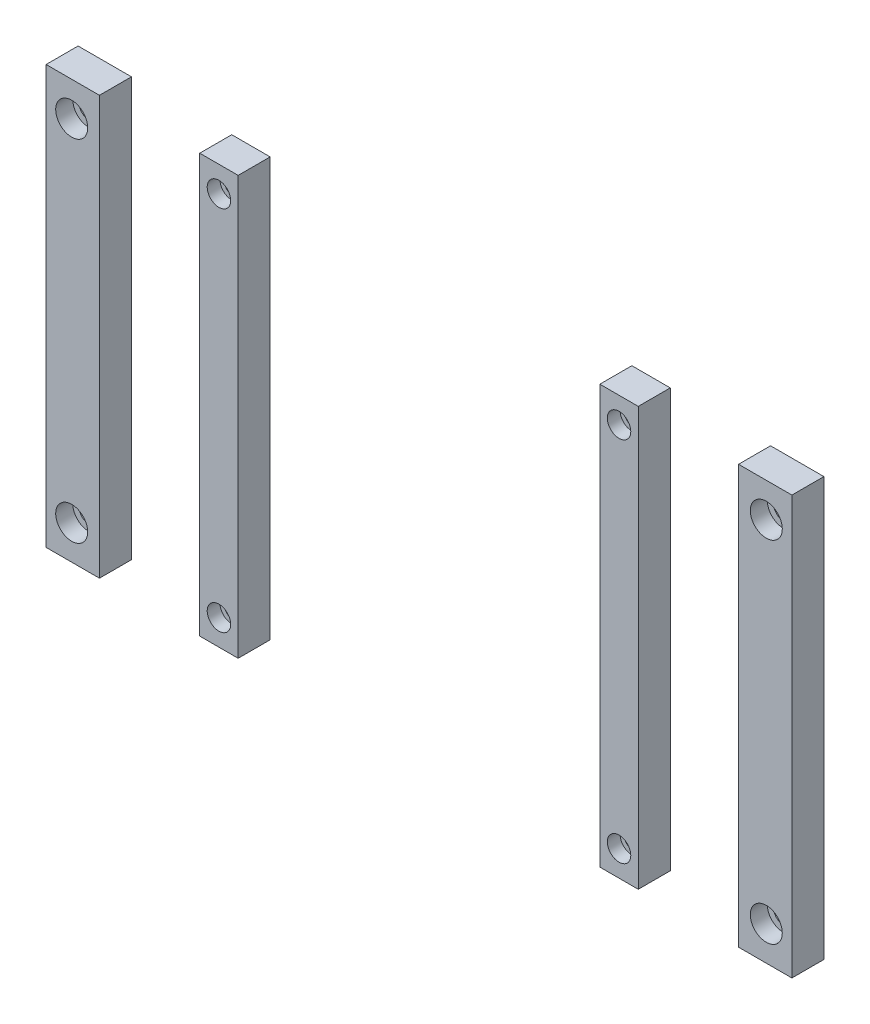
ISO-10303-21;
HEADER;
FILE_DESCRIPTION(('STEP AP214'),'2;1');
FILE_NAME('part.step','',(''),(''),'','','');
FILE_SCHEMA(('AUTOMOTIVE_DESIGN { 1 0 10303 214 1 1 1 1 }'));
ENDSEC;
DATA;
#1=APPLICATION_CONTEXT('core data for automotive mechanical design processes');
#2=APPLICATION_PROTOCOL_DEFINITION('international standard','automotive_design',2000,#1);
#3=PRODUCT_CONTEXT('',#1,'mechanical');
#4=PRODUCT('Part','Part','',(#3));
#5=PRODUCT_RELATED_PRODUCT_CATEGORY('part','',(#4));
#6=PRODUCT_DEFINITION_FORMATION('','',#4);
#7=PRODUCT_DEFINITION_CONTEXT('part definition',#1,'design');
#8=PRODUCT_DEFINITION('design','',#6,#7);
#9=PRODUCT_DEFINITION_SHAPE('','',#8);
#10=(LENGTH_UNIT() NAMED_UNIT(*) SI_UNIT(.MILLI.,.METRE.));
#11=(NAMED_UNIT(*) PLANE_ANGLE_UNIT() SI_UNIT($,.RADIAN.));
#12=(NAMED_UNIT(*) SI_UNIT($,.STERADIAN.) SOLID_ANGLE_UNIT());
#13=UNCERTAINTY_MEASURE_WITH_UNIT(LENGTH_MEASURE(1.E-05),#10,'distance_accuracy_value','');
#14=(GEOMETRIC_REPRESENTATION_CONTEXT(3) GLOBAL_UNCERTAINTY_ASSIGNED_CONTEXT((#13)) GLOBAL_UNIT_ASSIGNED_CONTEXT((#10,
#11,#12)) REPRESENTATION_CONTEXT('',''));
#15=CARTESIAN_POINT('',(0.,0.,0.));
#16=DIRECTION('',(0.,0.,1.));
#17=DIRECTION('',(1.,0.,0.));
#18=AXIS2_PLACEMENT_3D('',#15,#16,#17);
#19=CARTESIAN_POINT('',(50.0000000000001,-98.,15.));
#20=DIRECTION('',(0.,1.,0.));
#21=DIRECTION('',(0.,0.,1.));
#22=AXIS2_PLACEMENT_3D('',#19,#20,#21);
#23=PLANE('',#22);
#24=DIRECTION('',(1.,0.,0.));
#25=VECTOR('',#24,1.);
#26=CARTESIAN_POINT('',(50.0000000000001,-98.,0.));
#27=LINE('',#26,#25);
#28=CARTESIAN_POINT('',(50.0000000000001,-98.,0.));
#29=VERTEX_POINT('',#28);
#30=CARTESIAN_POINT('',(68.0000000000001,-98.,0.));
#31=VERTEX_POINT('',#30);
#32=EDGE_CURVE('E12',#29,#31,#27,.T.);
#33=ORIENTED_EDGE('',*,*,#32,.T.);
#34=DIRECTION('',(0.,0.,-1.));
#35=VECTOR('',#34,1.);
#36=CARTESIAN_POINT('',(68.0000000000001,-98.,15.));
#37=LINE('',#36,#35);
#38=CARTESIAN_POINT('',(68.0000000000001,-98.,15.));
#39=VERTEX_POINT('',#38);
#40=EDGE_CURVE('E118',#39,#31,#37,.T.);
#41=ORIENTED_EDGE('',*,*,#40,.F.);
#42=DIRECTION('',(1.,0.,0.));
#43=VECTOR('',#42,1.);
#44=CARTESIAN_POINT('',(50.0000000000001,-98.,15.));
#45=LINE('',#44,#43);
#46=CARTESIAN_POINT('',(50.0000000000001,-98.,15.));
#47=VERTEX_POINT('',#46);
#48=EDGE_CURVE('E51',#47,#39,#45,.T.);
#49=ORIENTED_EDGE('',*,*,#48,.F.);
#50=DIRECTION('',(0.,0.,-1.));
#51=VECTOR('',#50,1.);
#52=CARTESIAN_POINT('',(50.0000000000001,-98.,15.));
#53=LINE('',#52,#51);
#54=EDGE_CURVE('E106',#47,#29,#53,.T.);
#55=ORIENTED_EDGE('',*,*,#54,.T.);
#56=EDGE_LOOP('',(#33,#41,#49,#55));
#57=FACE_BOUND('',#56,.T.);
#58=ADVANCED_FACE('F47',(#57),#23,.F.);
#59=CARTESIAN_POINT('',(68.0000000000001,-98.,15.));
#60=DIRECTION('',(-1.,0.,0.));
#61=DIRECTION('',(0.,-1.,0.));
#62=AXIS2_PLACEMENT_3D('',#59,#60,#61);
#63=PLANE('',#62);
#64=DIRECTION('',(0.,1.,0.));
#65=VECTOR('',#64,1.);
#66=CARTESIAN_POINT('',(68.0000000000001,-98.,0.));
#67=LINE('',#66,#65);
#68=CARTESIAN_POINT('',(68.,98.0000000000001,0.));
#69=VERTEX_POINT('',#68);
#70=EDGE_CURVE('E57',#31,#69,#67,.T.);
#71=ORIENTED_EDGE('',*,*,#70,.T.);
#72=DIRECTION('',(0.,0.,-1.));
#73=VECTOR('',#72,1.);
#74=CARTESIAN_POINT('',(68.,98.0000000000001,15.));
#75=LINE('',#74,#73);
#76=CARTESIAN_POINT('',(68.,98.0000000000001,15.));
#77=VERTEX_POINT('',#76);
#78=EDGE_CURVE('E102',#77,#69,#75,.T.);
#79=ORIENTED_EDGE('',*,*,#78,.F.);
#80=DIRECTION('',(0.,1.,0.));
#81=VECTOR('',#80,1.);
#82=CARTESIAN_POINT('',(68.0000000000001,-98.,15.));
#83=LINE('',#82,#81);
#84=EDGE_CURVE('E81',#39,#77,#83,.T.);
#85=ORIENTED_EDGE('',*,*,#84,.F.);
#86=ORIENTED_EDGE('',*,*,#40,.T.);
#87=EDGE_LOOP('',(#71,#79,#85,#86));
#88=FACE_BOUND('',#87,.T.);
#89=ADVANCED_FACE('F171',(#88),#63,.F.);
#90=CARTESIAN_POINT('',(50.,98.,15.));
#91=DIRECTION('',(0.,-1.,0.));
#92=DIRECTION('',(1.,0.,0.));
#93=AXIS2_PLACEMENT_3D('',#90,#91,#92);
#94=PLANE('',#93);
#95=DIRECTION('',(-1.,0.,0.));
#96=VECTOR('',#95,1.);
#97=CARTESIAN_POINT('',(50.,98.,0.));
#98=LINE('',#97,#96);
#99=CARTESIAN_POINT('',(50.,98.,0.));
#100=VERTEX_POINT('',#99);
#101=EDGE_CURVE('E97',#69,#100,#98,.T.);
#102=ORIENTED_EDGE('',*,*,#101,.T.);
#103=DIRECTION('',(0.,0.,-1.));
#104=VECTOR('',#103,1.);
#105=CARTESIAN_POINT('',(50.,98.,15.));
#106=LINE('',#105,#104);
#107=CARTESIAN_POINT('',(50.,98.,15.));
#108=VERTEX_POINT('',#107);
#109=EDGE_CURVE('E100',#108,#100,#106,.T.);
#110=ORIENTED_EDGE('',*,*,#109,.F.);
#111=DIRECTION('',(-1.,0.,0.));
#112=VECTOR('',#111,1.);
#113=CARTESIAN_POINT('',(50.,98.,15.));
#114=LINE('',#113,#112);
#115=EDGE_CURVE('E114',#77,#108,#114,.T.);
#116=ORIENTED_EDGE('',*,*,#115,.F.);
#117=ORIENTED_EDGE('',*,*,#78,.T.);
#118=EDGE_LOOP('',(#102,#110,#116,#117));
#119=FACE_BOUND('',#118,.T.);
#120=ADVANCED_FACE('F98',(#119),#94,.F.);
#121=CARTESIAN_POINT('',(50.0000000000001,-98.,15.));
#122=DIRECTION('',(1.,0.,0.));
#123=DIRECTION('',(0.,1.,0.));
#124=AXIS2_PLACEMENT_3D('',#121,#122,#123);
#125=PLANE('',#124);
#126=DIRECTION('',(0.,-1.,0.));
#127=VECTOR('',#126,1.);
#128=CARTESIAN_POINT('',(50.0000000000001,-98.,0.));
#129=LINE('',#128,#127);
#130=EDGE_CURVE('E91',#100,#29,#129,.T.);
#131=ORIENTED_EDGE('',*,*,#130,.T.);
#132=ORIENTED_EDGE('',*,*,#54,.F.);
#133=DIRECTION('',(0.,-1.,0.));
#134=VECTOR('',#133,1.);
#135=CARTESIAN_POINT('',(50.0000000000001,-98.,15.));
#136=LINE('',#135,#134);
#137=EDGE_CURVE('E105',#108,#47,#136,.T.);
#138=ORIENTED_EDGE('',*,*,#137,.F.);
#139=ORIENTED_EDGE('',*,*,#109,.T.);
#140=EDGE_LOOP('',(#131,#132,#138,#139));
#141=FACE_BOUND('',#140,.T.);
#142=ADVANCED_FACE('F104',(#141),#125,.F.);
#143=CARTESIAN_POINT('',(0.,0.,15.));
#144=DIRECTION('',(0.,0.,1.));
#145=DIRECTION('',(1.,0.,0.));
#146=AXIS2_PLACEMENT_3D('',#143,#144,#145);
#147=PLANE('',#146);
#148=CARTESIAN_POINT('',(59.,86.0000000000001,15.));
#149=DIRECTION('',(0.,0.,1.));
#150=DIRECTION('',(1.,0.,0.));
#151=AXIS2_PLACEMENT_3D('',#148,#149,#150);
#152=CIRCLE('',#151,5.49999999999999);
#153=CARTESIAN_POINT('',(64.5,86.0000000000001,15.));
#154=VERTEX_POINT('',#153);
#155=EDGE_CURVE('E143',#154,#154,#152,.T.);
#156=ORIENTED_EDGE('',*,*,#155,.F.);
#157=EDGE_LOOP('',(#156));
#158=FACE_BOUND('',#157,.T.);
#159=CARTESIAN_POINT('',(59.0000000000001,-86.,15.));
#160=DIRECTION('',(0.,0.,1.));
#161=DIRECTION('',(1.,0.,0.));
#162=AXIS2_PLACEMENT_3D('',#159,#160,#161);
#163=CIRCLE('',#162,5.49999999999999);
#164=CARTESIAN_POINT('',(64.5000000000001,-86.,15.));
#165=VERTEX_POINT('',#164);
#166=EDGE_CURVE('E131',#165,#165,#163,.T.);
#167=ORIENTED_EDGE('',*,*,#166,.F.);
#168=EDGE_LOOP('',(#167));
#169=FACE_BOUND('',#168,.T.);
#170=ORIENTED_EDGE('',*,*,#48,.T.);
#171=ORIENTED_EDGE('',*,*,#84,.T.);
#172=ORIENTED_EDGE('',*,*,#115,.T.);
#173=ORIENTED_EDGE('',*,*,#137,.T.);
#174=EDGE_LOOP('',(#170,#171,#172,#173));
#175=FACE_BOUND('',#174,.T.);
#176=ADVANCED_FACE('F49',(#158,#169,#175),#147,.T.);
#177=CARTESIAN_POINT('',(0.,0.,0.));
#178=DIRECTION('',(0.,0.,1.));
#179=DIRECTION('',(1.,0.,0.));
#180=AXIS2_PLACEMENT_3D('',#177,#178,#179);
#181=PLANE('',#180);
#182=CARTESIAN_POINT('',(59.,86.0000000000001,0.));
#183=DIRECTION('',(0.,0.,1.));
#184=DIRECTION('',(1.,0.,0.));
#185=AXIS2_PLACEMENT_3D('',#182,#183,#184);
#186=CIRCLE('',#185,3.3);
#187=CARTESIAN_POINT('',(62.3000000000001,86.0000000000001,0.));
#188=VERTEX_POINT('',#187);
#189=EDGE_CURVE('E134',#188,#188,#186,.T.);
#190=ORIENTED_EDGE('',*,*,#189,.T.);
#191=EDGE_LOOP('',(#190));
#192=FACE_BOUND('',#191,.T.);
#193=CARTESIAN_POINT('',(59.0000000000001,-86.,0.));
#194=DIRECTION('',(0.,0.,1.));
#195=DIRECTION('',(1.,0.,0.));
#196=AXIS2_PLACEMENT_3D('',#193,#194,#195);
#197=CIRCLE('',#196,3.3);
#198=CARTESIAN_POINT('',(62.3000000000001,-86.,0.));
#199=VERTEX_POINT('',#198);
#200=EDGE_CURVE('E119',#199,#199,#197,.T.);
#201=ORIENTED_EDGE('',*,*,#200,.T.);
#202=EDGE_LOOP('',(#201));
#203=FACE_BOUND('',#202,.T.);
#204=ORIENTED_EDGE('',*,*,#32,.F.);
#205=ORIENTED_EDGE('',*,*,#130,.F.);
#206=ORIENTED_EDGE('',*,*,#101,.F.);
#207=ORIENTED_EDGE('',*,*,#70,.F.);
#208=EDGE_LOOP('',(#204,#205,#206,#207));
#209=FACE_BOUND('',#208,.T.);
#210=ADVANCED_FACE('F108',(#192,#203,#209),#181,.F.);
#211=CARTESIAN_POINT('',(59.0000000000001,-86.,15.));
#212=DIRECTION('',(0.,0.,1.));
#213=DIRECTION('',(1.,0.,0.));
#214=AXIS2_PLACEMENT_3D('',#211,#212,#213);
#215=CYLINDRICAL_SURFACE('',#214,3.30000000000001);
#216=ORIENTED_EDGE('',*,*,#200,.F.);
#217=EDGE_LOOP('',(#216));
#218=FACE_BOUND('',#217,.T.);
#219=CARTESIAN_POINT('',(59.0000000000001,-86.,9.));
#220=DIRECTION('',(0.,0.,1.));
#221=DIRECTION('',(1.,0.,0.));
#222=AXIS2_PLACEMENT_3D('',#219,#220,#221);
#223=CIRCLE('',#222,3.30000000000001);
#224=CARTESIAN_POINT('',(62.3000000000001,-86.,9.));
#225=VERTEX_POINT('',#224);
#226=EDGE_CURVE('E123',#225,#225,#223,.T.);
#227=ORIENTED_EDGE('',*,*,#226,.T.);
#228=EDGE_LOOP('',(#227));
#229=FACE_BOUND('',#228,.T.);
#230=ADVANCED_FACE('F166',(#218,#229),#215,.F.);
#231=CARTESIAN_POINT('',(62.3000000000001,-86.,9.));
#232=DIRECTION('',(0.,0.,-1.));
#233=DIRECTION('',(-1.,0.,0.));
#234=AXIS2_PLACEMENT_3D('',#231,#232,#233);
#235=PLANE('',#234);
#236=ORIENTED_EDGE('',*,*,#226,.F.);
#237=EDGE_LOOP('',(#236));
#238=FACE_BOUND('',#237,.T.);
#239=CARTESIAN_POINT('',(59.0000000000001,-86.,9.));
#240=DIRECTION('',(0.,0.,1.));
#241=DIRECTION('',(1.,0.,0.));
#242=AXIS2_PLACEMENT_3D('',#239,#240,#241);
#243=CIRCLE('',#242,5.49999999999999);
#244=CARTESIAN_POINT('',(64.5000000000001,-86.,9.));
#245=VERTEX_POINT('',#244);
#246=EDGE_CURVE('E128',#245,#245,#243,.T.);
#247=ORIENTED_EDGE('',*,*,#246,.T.);
#248=EDGE_LOOP('',(#247));
#249=FACE_BOUND('',#248,.T.);
#250=ADVANCED_FACE('F156',(#238,#249),#235,.F.);
#251=CARTESIAN_POINT('',(59.0000000000001,-86.,15.));
#252=DIRECTION('',(0.,0.,1.));
#253=DIRECTION('',(1.,0.,0.));
#254=AXIS2_PLACEMENT_3D('',#251,#252,#253);
#255=CYLINDRICAL_SURFACE('',#254,5.49999999999999);
#256=ORIENTED_EDGE('',*,*,#246,.F.);
#257=EDGE_LOOP('',(#256));
#258=FACE_BOUND('',#257,.T.);
#259=ORIENTED_EDGE('',*,*,#166,.T.);
#260=EDGE_LOOP('',(#259));
#261=FACE_BOUND('',#260,.T.);
#262=ADVANCED_FACE('F153',(#258,#261),#255,.F.);
#263=CARTESIAN_POINT('',(59.,86.0000000000001,15.));
#264=DIRECTION('',(0.,0.,1.));
#265=DIRECTION('',(1.,0.,0.));
#266=AXIS2_PLACEMENT_3D('',#263,#264,#265);
#267=CYLINDRICAL_SURFACE('',#266,3.30000000000001);
#268=ORIENTED_EDGE('',*,*,#189,.F.);
#269=EDGE_LOOP('',(#268));
#270=FACE_BOUND('',#269,.T.);
#271=CARTESIAN_POINT('',(59.,86.0000000000001,9.));
#272=DIRECTION('',(0.,0.,1.));
#273=DIRECTION('',(1.,0.,0.));
#274=AXIS2_PLACEMENT_3D('',#271,#272,#273);
#275=CIRCLE('',#274,3.30000000000001);
#276=CARTESIAN_POINT('',(62.3000000000001,86.0000000000001,9.));
#277=VERTEX_POINT('',#276);
#278=EDGE_CURVE('E137',#277,#277,#275,.T.);
#279=ORIENTED_EDGE('',*,*,#278,.T.);
#280=EDGE_LOOP('',(#279));
#281=FACE_BOUND('',#280,.T.);
#282=ADVANCED_FACE('F155',(#270,#281),#267,.F.);
#283=CARTESIAN_POINT('',(62.3000000000001,86.0000000000001,9.));
#284=DIRECTION('',(0.,0.,-1.));
#285=DIRECTION('',(-1.,0.,0.));
#286=AXIS2_PLACEMENT_3D('',#283,#284,#285);
#287=PLANE('',#286);
#288=ORIENTED_EDGE('',*,*,#278,.F.);
#289=EDGE_LOOP('',(#288));
#290=FACE_BOUND('',#289,.T.);
#291=CARTESIAN_POINT('',(59.,86.0000000000001,9.));
#292=DIRECTION('',(0.,0.,1.));
#293=DIRECTION('',(1.,0.,0.));
#294=AXIS2_PLACEMENT_3D('',#291,#292,#293);
#295=CIRCLE('',#294,5.49999999999999);
#296=CARTESIAN_POINT('',(64.5,86.0000000000001,9.));
#297=VERTEX_POINT('',#296);
#298=EDGE_CURVE('E140',#297,#297,#295,.T.);
#299=ORIENTED_EDGE('',*,*,#298,.T.);
#300=EDGE_LOOP('',(#299));
#301=FACE_BOUND('',#300,.T.);
#302=ADVANCED_FACE('F163',(#290,#301),#287,.F.);
#303=CARTESIAN_POINT('',(59.,86.0000000000001,15.));
#304=DIRECTION('',(0.,0.,1.));
#305=DIRECTION('',(1.,0.,0.));
#306=AXIS2_PLACEMENT_3D('',#303,#304,#305);
#307=CYLINDRICAL_SURFACE('',#306,5.49999999999999);
#308=ORIENTED_EDGE('',*,*,#298,.F.);
#309=EDGE_LOOP('',(#308));
#310=FACE_BOUND('',#309,.T.);
#311=ORIENTED_EDGE('',*,*,#155,.T.);
#312=EDGE_LOOP('',(#311));
#313=FACE_BOUND('',#312,.T.);
#314=ADVANCED_FACE('F147',(#310,#313),#307,.F.);
#315=CLOSED_SHELL('',(#58,#89,#120,#142,#176,#210,#230,#250,#262,#282,#302,#314));
#316=MANIFOLD_SOLID_BREP('B2',#315);
#317=CARTESIAN_POINT('',(140.,-98.,15.));
#318=DIRECTION('',(0.,1.,0.));
#319=DIRECTION('',(-1.,0.,0.));
#320=AXIS2_PLACEMENT_3D('',#317,#318,#319);
#321=PLANE('',#320);
#322=DIRECTION('',(1.,0.,0.));
#323=VECTOR('',#322,1.);
#324=CARTESIAN_POINT('',(140.,-98.,0.));
#325=LINE('',#324,#323);
#326=CARTESIAN_POINT('',(115.,-98.,0.));
#327=VERTEX_POINT('',#326);
#328=CARTESIAN_POINT('',(140.,-98.,0.));
#329=VERTEX_POINT('',#328);
#330=EDGE_CURVE('E45',#327,#329,#325,.T.);
#331=ORIENTED_EDGE('',*,*,#330,.T.);
#332=DIRECTION('',(0.,0.,-1.));
#333=VECTOR('',#332,1.);
#334=CARTESIAN_POINT('',(140.,-98.,15.));
#335=LINE('',#334,#333);
#336=CARTESIAN_POINT('',(140.,-98.,15.));
#337=VERTEX_POINT('',#336);
#338=EDGE_CURVE('E377',#337,#329,#335,.T.);
#339=ORIENTED_EDGE('',*,*,#338,.F.);
#340=DIRECTION('',(1.,0.,0.));
#341=VECTOR('',#340,1.);
#342=CARTESIAN_POINT('',(140.,-98.,15.));
#343=LINE('',#342,#341);
#344=CARTESIAN_POINT('',(115.,-98.,15.));
#345=VERTEX_POINT('',#344);
#346=EDGE_CURVE('E310',#345,#337,#343,.T.);
#347=ORIENTED_EDGE('',*,*,#346,.F.);
#348=DIRECTION('',(0.,0.,-1.));
#349=VECTOR('',#348,1.);
#350=CARTESIAN_POINT('',(115.,-98.,15.));
#351=LINE('',#350,#349);
#352=EDGE_CURVE('E365',#345,#327,#351,.T.);
#353=ORIENTED_EDGE('',*,*,#352,.T.);
#354=EDGE_LOOP('',(#331,#339,#347,#353));
#355=FACE_BOUND('',#354,.T.);
#356=ADVANCED_FACE('F306',(#355),#321,.F.);
#357=CARTESIAN_POINT('',(140.,-98.,15.));
#358=DIRECTION('',(-1.,0.,0.));
#359=DIRECTION('',(0.,-1.,0.));
#360=AXIS2_PLACEMENT_3D('',#357,#358,#359);
#361=PLANE('',#360);
#362=DIRECTION('',(0.,1.,0.));
#363=VECTOR('',#362,1.);
#364=CARTESIAN_POINT('',(140.,-98.,0.));
#365=LINE('',#364,#363);
#366=CARTESIAN_POINT('',(140.,98.0000000000001,0.));
#367=VERTEX_POINT('',#366);
#368=EDGE_CURVE('E316',#329,#367,#365,.T.);
#369=ORIENTED_EDGE('',*,*,#368,.T.);
#370=DIRECTION('',(0.,0.,-1.));
#371=VECTOR('',#370,1.);
#372=CARTESIAN_POINT('',(140.,98.0000000000001,15.));
#373=LINE('',#372,#371);
#374=CARTESIAN_POINT('',(140.,98.0000000000001,15.));
#375=VERTEX_POINT('',#374);
#376=EDGE_CURVE('E361',#375,#367,#373,.T.);
#377=ORIENTED_EDGE('',*,*,#376,.F.);
#378=DIRECTION('',(0.,1.,0.));
#379=VECTOR('',#378,1.);
#380=CARTESIAN_POINT('',(140.,-98.,15.));
#381=LINE('',#380,#379);
#382=EDGE_CURVE('E340',#337,#375,#381,.T.);
#383=ORIENTED_EDGE('',*,*,#382,.F.);
#384=ORIENTED_EDGE('',*,*,#338,.T.);
#385=EDGE_LOOP('',(#369,#377,#383,#384));
#386=FACE_BOUND('',#385,.T.);
#387=ADVANCED_FACE('F430',(#386),#361,.F.);
#388=CARTESIAN_POINT('',(140.,98.0000000000001,15.));
#389=DIRECTION('',(0.,-1.,0.));
#390=DIRECTION('',(0.,0.,-1.));
#391=AXIS2_PLACEMENT_3D('',#388,#389,#390);
#392=PLANE('',#391);
#393=DIRECTION('',(-1.,0.,0.));
#394=VECTOR('',#393,1.);
#395=CARTESIAN_POINT('',(140.,98.0000000000001,0.));
#396=LINE('',#395,#394);
#397=CARTESIAN_POINT('',(115.,98.0000000000001,0.));
#398=VERTEX_POINT('',#397);
#399=EDGE_CURVE('E356',#367,#398,#396,.T.);
#400=ORIENTED_EDGE('',*,*,#399,.T.);
#401=DIRECTION('',(0.,0.,-1.));
#402=VECTOR('',#401,1.);
#403=CARTESIAN_POINT('',(115.,98.0000000000001,15.));
#404=LINE('',#403,#402);
#405=CARTESIAN_POINT('',(115.,98.0000000000001,15.));
#406=VERTEX_POINT('',#405);
#407=EDGE_CURVE('E359',#406,#398,#404,.T.);
#408=ORIENTED_EDGE('',*,*,#407,.F.);
#409=DIRECTION('',(-1.,0.,0.));
#410=VECTOR('',#409,1.);
#411=CARTESIAN_POINT('',(140.,98.0000000000001,15.));
#412=LINE('',#411,#410);
#413=EDGE_CURVE('E373',#375,#406,#412,.T.);
#414=ORIENTED_EDGE('',*,*,#413,.F.);
#415=ORIENTED_EDGE('',*,*,#376,.T.);
#416=EDGE_LOOP('',(#400,#408,#414,#415));
#417=FACE_BOUND('',#416,.T.);
#418=ADVANCED_FACE('F357',(#417),#392,.F.);
#419=CARTESIAN_POINT('',(115.,-98.,15.));
#420=DIRECTION('',(1.,0.,0.));
#421=DIRECTION('',(0.,1.,0.));
#422=AXIS2_PLACEMENT_3D('',#419,#420,#421);
#423=PLANE('',#422);
#424=DIRECTION('',(0.,-1.,0.));
#425=VECTOR('',#424,1.);
#426=CARTESIAN_POINT('',(115.,-98.,0.));
#427=LINE('',#426,#425);
#428=EDGE_CURVE('E350',#398,#327,#427,.T.);
#429=ORIENTED_EDGE('',*,*,#428,.T.);
#430=ORIENTED_EDGE('',*,*,#352,.F.);
#431=DIRECTION('',(0.,-1.,0.));
#432=VECTOR('',#431,1.);
#433=CARTESIAN_POINT('',(115.,-98.,15.));
#434=LINE('',#433,#432);
#435=EDGE_CURVE('E364',#406,#345,#434,.T.);
#436=ORIENTED_EDGE('',*,*,#435,.F.);
#437=ORIENTED_EDGE('',*,*,#407,.T.);
#438=EDGE_LOOP('',(#429,#430,#436,#437));
#439=FACE_BOUND('',#438,.T.);
#440=ADVANCED_FACE('F363',(#439),#423,.F.);
#441=CARTESIAN_POINT('',(0.,0.,15.));
#442=DIRECTION('',(0.,0.,-1.));
#443=DIRECTION('',(-1.,0.,0.));
#444=AXIS2_PLACEMENT_3D('',#441,#442,#443);
#445=PLANE('',#444);
#446=CARTESIAN_POINT('',(128.,-82.,15.));
#447=DIRECTION('',(0.,0.,1.));
#448=DIRECTION('',(1.,0.,0.));
#449=AXIS2_PLACEMENT_3D('',#446,#447,#448);
#450=CIRCLE('',#449,7.50000000000001);
#451=CARTESIAN_POINT('',(135.5,-82.,15.));
#452=VERTEX_POINT('',#451);
#453=EDGE_CURVE('E402',#452,#452,#450,.T.);
#454=ORIENTED_EDGE('',*,*,#453,.F.);
#455=EDGE_LOOP('',(#454));
#456=FACE_BOUND('',#455,.T.);
#457=CARTESIAN_POINT('',(128.,82.0000000000001,15.));
#458=DIRECTION('',(0.,0.,1.));
#459=DIRECTION('',(1.,0.,0.));
#460=AXIS2_PLACEMENT_3D('',#457,#458,#459);
#461=CIRCLE('',#460,7.50000000000001);
#462=CARTESIAN_POINT('',(135.5,82.0000000000001,15.));
#463=VERTEX_POINT('',#462);
#464=EDGE_CURVE('E390',#463,#463,#461,.T.);
#465=ORIENTED_EDGE('',*,*,#464,.F.);
#466=EDGE_LOOP('',(#465));
#467=FACE_BOUND('',#466,.T.);
#468=ORIENTED_EDGE('',*,*,#346,.T.);
#469=ORIENTED_EDGE('',*,*,#382,.T.);
#470=ORIENTED_EDGE('',*,*,#413,.T.);
#471=ORIENTED_EDGE('',*,*,#435,.T.);
#472=EDGE_LOOP('',(#468,#469,#470,#471));
#473=FACE_BOUND('',#472,.T.);
#474=ADVANCED_FACE('F308',(#456,#467,#473),#445,.F.);
#475=CARTESIAN_POINT('',(0.,0.,0.));
#476=DIRECTION('',(0.,0.,-1.));
#477=DIRECTION('',(-1.,0.,0.));
#478=AXIS2_PLACEMENT_3D('',#475,#476,#477);
#479=PLANE('',#478);
#480=CARTESIAN_POINT('',(128.,-82.,0.));
#481=DIRECTION('',(0.,0.,1.));
#482=DIRECTION('',(1.,0.,0.));
#483=AXIS2_PLACEMENT_3D('',#480,#481,#482);
#484=CIRCLE('',#483,4.5);
#485=CARTESIAN_POINT('',(132.5,-82.,0.));
#486=VERTEX_POINT('',#485);
#487=EDGE_CURVE('E393',#486,#486,#484,.T.);
#488=ORIENTED_EDGE('',*,*,#487,.T.);
#489=EDGE_LOOP('',(#488));
#490=FACE_BOUND('',#489,.T.);
#491=CARTESIAN_POINT('',(128.,82.0000000000001,0.));
#492=DIRECTION('',(0.,0.,1.));
#493=DIRECTION('',(1.,0.,0.));
#494=AXIS2_PLACEMENT_3D('',#491,#492,#493);
#495=CIRCLE('',#494,4.5);
#496=CARTESIAN_POINT('',(132.5,82.0000000000001,0.));
#497=VERTEX_POINT('',#496);
#498=EDGE_CURVE('E378',#497,#497,#495,.T.);
#499=ORIENTED_EDGE('',*,*,#498,.T.);
#500=EDGE_LOOP('',(#499));
#501=FACE_BOUND('',#500,.T.);
#502=ORIENTED_EDGE('',*,*,#330,.F.);
#503=ORIENTED_EDGE('',*,*,#428,.F.);
#504=ORIENTED_EDGE('',*,*,#399,.F.);
#505=ORIENTED_EDGE('',*,*,#368,.F.);
#506=EDGE_LOOP('',(#502,#503,#504,#505));
#507=FACE_BOUND('',#506,.T.);
#508=ADVANCED_FACE('F367',(#490,#501,#507),#479,.T.);
#509=CARTESIAN_POINT('',(128.,82.0000000000001,15.));
#510=DIRECTION('',(0.,0.,1.));
#511=DIRECTION('',(1.,0.,0.));
#512=AXIS2_PLACEMENT_3D('',#509,#510,#511);
#513=CYLINDRICAL_SURFACE('',#512,4.5);
#514=ORIENTED_EDGE('',*,*,#498,.F.);
#515=EDGE_LOOP('',(#514));
#516=FACE_BOUND('',#515,.T.);
#517=CARTESIAN_POINT('',(128.,82.0000000000001,7.));
#518=DIRECTION('',(0.,0.,1.));
#519=DIRECTION('',(1.,0.,0.));
#520=AXIS2_PLACEMENT_3D('',#517,#518,#519);
#521=CIRCLE('',#520,4.5);
#522=CARTESIAN_POINT('',(132.5,82.0000000000001,7.));
#523=VERTEX_POINT('',#522);
#524=EDGE_CURVE('E382',#523,#523,#521,.T.);
#525=ORIENTED_EDGE('',*,*,#524,.T.);
#526=EDGE_LOOP('',(#525));
#527=FACE_BOUND('',#526,.T.);
#528=ADVANCED_FACE('F425',(#516,#527),#513,.F.);
#529=CARTESIAN_POINT('',(132.5,82.0000000000001,7.));
#530=DIRECTION('',(0.,0.,-1.));
#531=DIRECTION('',(-1.,0.,0.));
#532=AXIS2_PLACEMENT_3D('',#529,#530,#531);
#533=PLANE('',#532);
#534=ORIENTED_EDGE('',*,*,#524,.F.);
#535=EDGE_LOOP('',(#534));
#536=FACE_BOUND('',#535,.T.);
#537=CARTESIAN_POINT('',(128.,82.0000000000001,7.));
#538=DIRECTION('',(0.,0.,1.));
#539=DIRECTION('',(1.,0.,0.));
#540=AXIS2_PLACEMENT_3D('',#537,#538,#539);
#541=CIRCLE('',#540,7.50000000000001);
#542=CARTESIAN_POINT('',(135.5,82.0000000000001,7.));
#543=VERTEX_POINT('',#542);
#544=EDGE_CURVE('E387',#543,#543,#541,.T.);
#545=ORIENTED_EDGE('',*,*,#544,.T.);
#546=EDGE_LOOP('',(#545));
#547=FACE_BOUND('',#546,.T.);
#548=ADVANCED_FACE('F415',(#536,#547),#533,.F.);
#549=CARTESIAN_POINT('',(128.,82.0000000000001,15.));
#550=DIRECTION('',(0.,0.,1.));
#551=DIRECTION('',(1.,0.,0.));
#552=AXIS2_PLACEMENT_3D('',#549,#550,#551);
#553=CYLINDRICAL_SURFACE('',#552,7.50000000000001);
#554=ORIENTED_EDGE('',*,*,#544,.F.);
#555=EDGE_LOOP('',(#554));
#556=FACE_BOUND('',#555,.T.);
#557=ORIENTED_EDGE('',*,*,#464,.T.);
#558=EDGE_LOOP('',(#557));
#559=FACE_BOUND('',#558,.T.);
#560=ADVANCED_FACE('F412',(#556,#559),#553,.F.);
#561=CARTESIAN_POINT('',(128.,-82.,15.));
#562=DIRECTION('',(0.,0.,1.));
#563=DIRECTION('',(1.,0.,0.));
#564=AXIS2_PLACEMENT_3D('',#561,#562,#563);
#565=CYLINDRICAL_SURFACE('',#564,4.5);
#566=ORIENTED_EDGE('',*,*,#487,.F.);
#567=EDGE_LOOP('',(#566));
#568=FACE_BOUND('',#567,.T.);
#569=CARTESIAN_POINT('',(128.,-82.,7.));
#570=DIRECTION('',(0.,0.,1.));
#571=DIRECTION('',(1.,0.,0.));
#572=AXIS2_PLACEMENT_3D('',#569,#570,#571);
#573=CIRCLE('',#572,4.5);
#574=CARTESIAN_POINT('',(132.5,-82.,7.));
#575=VERTEX_POINT('',#574);
#576=EDGE_CURVE('E396',#575,#575,#573,.T.);
#577=ORIENTED_EDGE('',*,*,#576,.T.);
#578=EDGE_LOOP('',(#577));
#579=FACE_BOUND('',#578,.T.);
#580=ADVANCED_FACE('F414',(#568,#579),#565,.F.);
#581=CARTESIAN_POINT('',(132.5,-82.,7.));
#582=DIRECTION('',(0.,0.,-1.));
#583=DIRECTION('',(-1.,0.,0.));
#584=AXIS2_PLACEMENT_3D('',#581,#582,#583);
#585=PLANE('',#584);
#586=ORIENTED_EDGE('',*,*,#576,.F.);
#587=EDGE_LOOP('',(#586));
#588=FACE_BOUND('',#587,.T.);
#589=CARTESIAN_POINT('',(128.,-82.,7.));
#590=DIRECTION('',(0.,0.,1.));
#591=DIRECTION('',(1.,0.,0.));
#592=AXIS2_PLACEMENT_3D('',#589,#590,#591);
#593=CIRCLE('',#592,7.50000000000001);
#594=CARTESIAN_POINT('',(135.5,-82.,7.));
#595=VERTEX_POINT('',#594);
#596=EDGE_CURVE('E399',#595,#595,#593,.T.);
#597=ORIENTED_EDGE('',*,*,#596,.T.);
#598=EDGE_LOOP('',(#597));
#599=FACE_BOUND('',#598,.T.);
#600=ADVANCED_FACE('F422',(#588,#599),#585,.F.);
#601=CARTESIAN_POINT('',(128.,-82.,15.));
#602=DIRECTION('',(0.,0.,1.));
#603=DIRECTION('',(1.,0.,0.));
#604=AXIS2_PLACEMENT_3D('',#601,#602,#603);
#605=CYLINDRICAL_SURFACE('',#604,7.50000000000001);
#606=ORIENTED_EDGE('',*,*,#596,.F.);
#607=EDGE_LOOP('',(#606));
#608=FACE_BOUND('',#607,.T.);
#609=ORIENTED_EDGE('',*,*,#453,.T.);
#610=EDGE_LOOP('',(#609));
#611=FACE_BOUND('',#610,.T.);
#612=ADVANCED_FACE('F406',(#608,#611),#605,.F.);
#613=CLOSED_SHELL('',(#356,#387,#418,#440,#474,#508,#528,#548,#560,#580,#600,#612));
#614=MANIFOLD_SOLID_BREP('B6',#613);
#615=CARTESIAN_POINT('',(-209.5,-98.,15.));
#616=DIRECTION('',(1.,0.,0.));
#617=DIRECTION('',(0.,0.,-1.));
#618=AXIS2_PLACEMENT_3D('',#615,#616,#617);
#619=PLANE('',#618);
#620=DIRECTION('',(0.,-1.,0.));
#621=VECTOR('',#620,1.);
#622=CARTESIAN_POINT('',(-209.5,-98.,0.));
#623=LINE('',#622,#621);
#624=CARTESIAN_POINT('',(-209.5,98.,0.));
#625=VERTEX_POINT('',#624);
#626=CARTESIAN_POINT('',(-209.5,-98.,0.));
#627=VERTEX_POINT('',#626);
#628=EDGE_CURVE('E304',#625,#627,#623,.T.);
#629=ORIENTED_EDGE('',*,*,#628,.T.);
#630=DIRECTION('',(0.,0.,-1.));
#631=VECTOR('',#630,1.);
#632=CARTESIAN_POINT('',(-209.5,-98.,15.));
#633=LINE('',#632,#631);
#634=CARTESIAN_POINT('',(-209.5,-98.,15.));
#635=VERTEX_POINT('',#634);
#636=EDGE_CURVE('E636',#635,#627,#633,.T.);
#637=ORIENTED_EDGE('',*,*,#636,.F.);
#638=DIRECTION('',(0.,-1.,0.));
#639=VECTOR('',#638,1.);
#640=CARTESIAN_POINT('',(-209.5,-98.,15.));
#641=LINE('',#640,#639);
#642=CARTESIAN_POINT('',(-209.5,98.,15.));
#643=VERTEX_POINT('',#642);
#644=EDGE_CURVE('E569',#643,#635,#641,.T.);
#645=ORIENTED_EDGE('',*,*,#644,.F.);
#646=DIRECTION('',(0.,0.,-1.));
#647=VECTOR('',#646,1.);
#648=CARTESIAN_POINT('',(-209.5,98.,15.));
#649=LINE('',#648,#647);
#650=EDGE_CURVE('E624',#643,#625,#649,.T.);
#651=ORIENTED_EDGE('',*,*,#650,.T.);
#652=EDGE_LOOP('',(#629,#637,#645,#651));
#653=FACE_BOUND('',#652,.T.);
#654=ADVANCED_FACE('F565',(#653),#619,.F.);
#655=CARTESIAN_POINT('',(-209.5,-98.,15.));
#656=DIRECTION('',(0.,1.,0.));
#657=DIRECTION('',(0.,0.,1.));
#658=AXIS2_PLACEMENT_3D('',#655,#656,#657);
#659=PLANE('',#658);
#660=DIRECTION('',(1.,0.,0.));
#661=VECTOR('',#660,1.);
#662=CARTESIAN_POINT('',(-209.5,-98.,0.));
#663=LINE('',#662,#661);
#664=CARTESIAN_POINT('',(-184.5,-98.,0.));
#665=VERTEX_POINT('',#664);
#666=EDGE_CURVE('E575',#627,#665,#663,.T.);
#667=ORIENTED_EDGE('',*,*,#666,.T.);
#668=DIRECTION('',(0.,0.,-1.));
#669=VECTOR('',#668,1.);
#670=CARTESIAN_POINT('',(-184.5,-98.,15.));
#671=LINE('',#670,#669);
#672=CARTESIAN_POINT('',(-184.5,-98.,15.));
#673=VERTEX_POINT('',#672);
#674=EDGE_CURVE('E620',#673,#665,#671,.T.);
#675=ORIENTED_EDGE('',*,*,#674,.F.);
#676=DIRECTION('',(1.,0.,0.));
#677=VECTOR('',#676,1.);
#678=CARTESIAN_POINT('',(-209.5,-98.,15.));
#679=LINE('',#678,#677);
#680=EDGE_CURVE('E599',#635,#673,#679,.T.);
#681=ORIENTED_EDGE('',*,*,#680,.F.);
#682=ORIENTED_EDGE('',*,*,#636,.T.);
#683=EDGE_LOOP('',(#667,#675,#681,#682));
#684=FACE_BOUND('',#683,.T.);
#685=ADVANCED_FACE('F689',(#684),#659,.F.);
#686=CARTESIAN_POINT('',(-184.5,-98.,15.));
#687=DIRECTION('',(-1.,0.,0.));
#688=DIRECTION('',(0.,0.,1.));
#689=AXIS2_PLACEMENT_3D('',#686,#687,#688);
#690=PLANE('',#689);
#691=DIRECTION('',(0.,1.,0.));
#692=VECTOR('',#691,1.);
#693=CARTESIAN_POINT('',(-184.5,-98.,0.));
#694=LINE('',#693,#692);
#695=CARTESIAN_POINT('',(-184.5,98.,0.));
#696=VERTEX_POINT('',#695);
#697=EDGE_CURVE('E615',#665,#696,#694,.T.);
#698=ORIENTED_EDGE('',*,*,#697,.T.);
#699=DIRECTION('',(0.,0.,-1.));
#700=VECTOR('',#699,1.);
#701=CARTESIAN_POINT('',(-184.5,98.,15.));
#702=LINE('',#701,#700);
#703=CARTESIAN_POINT('',(-184.5,98.,15.));
#704=VERTEX_POINT('',#703);
#705=EDGE_CURVE('E618',#704,#696,#702,.T.);
#706=ORIENTED_EDGE('',*,*,#705,.F.);
#707=DIRECTION('',(0.,1.,0.));
#708=VECTOR('',#707,1.);
#709=CARTESIAN_POINT('',(-184.5,-98.,15.));
#710=LINE('',#709,#708);
#711=EDGE_CURVE('E632',#673,#704,#710,.T.);
#712=ORIENTED_EDGE('',*,*,#711,.F.);
#713=ORIENTED_EDGE('',*,*,#674,.T.);
#714=EDGE_LOOP('',(#698,#706,#712,#713));
#715=FACE_BOUND('',#714,.T.);
#716=ADVANCED_FACE('F616',(#715),#690,.F.);
#717=CARTESIAN_POINT('',(-209.5,98.,15.));
#718=DIRECTION('',(0.,-1.,0.));
#719=DIRECTION('',(0.,0.,-1.));
#720=AXIS2_PLACEMENT_3D('',#717,#718,#719);
#721=PLANE('',#720);
#722=DIRECTION('',(-1.,0.,0.));
#723=VECTOR('',#722,1.);
#724=CARTESIAN_POINT('',(-209.5,98.,0.));
#725=LINE('',#724,#723);
#726=EDGE_CURVE('E609',#696,#625,#725,.T.);
#727=ORIENTED_EDGE('',*,*,#726,.T.);
#728=ORIENTED_EDGE('',*,*,#650,.F.);
#729=DIRECTION('',(-1.,0.,0.));
#730=VECTOR('',#729,1.);
#731=CARTESIAN_POINT('',(-209.5,98.,15.));
#732=LINE('',#731,#730);
#733=EDGE_CURVE('E623',#704,#643,#732,.T.);
#734=ORIENTED_EDGE('',*,*,#733,.F.);
#735=ORIENTED_EDGE('',*,*,#705,.T.);
#736=EDGE_LOOP('',(#727,#728,#734,#735));
#737=FACE_BOUND('',#736,.T.);
#738=ADVANCED_FACE('F622',(#737),#721,.F.);
#739=CARTESIAN_POINT('',(0.,0.,15.));
#740=DIRECTION('',(0.,0.,-1.));
#741=DIRECTION('',(-1.,0.,0.));
#742=AXIS2_PLACEMENT_3D('',#739,#740,#741);
#743=PLANE('',#742);
#744=CARTESIAN_POINT('',(-197.5,82.,15.));
#745=DIRECTION('',(0.,0.,1.));
#746=DIRECTION('',(1.,0.,0.));
#747=AXIS2_PLACEMENT_3D('',#744,#745,#746);
#748=CIRCLE('',#747,7.50000000000001);
#749=CARTESIAN_POINT('',(-190.,82.,15.));
#750=VERTEX_POINT('',#749);
#751=EDGE_CURVE('E661',#750,#750,#748,.T.);
#752=ORIENTED_EDGE('',*,*,#751,.F.);
#753=EDGE_LOOP('',(#752));
#754=FACE_BOUND('',#753,.T.);
#755=CARTESIAN_POINT('',(-197.5,-82.,15.));
#756=DIRECTION('',(0.,0.,1.));
#757=DIRECTION('',(1.,0.,0.));
#758=AXIS2_PLACEMENT_3D('',#755,#756,#757);
#759=CIRCLE('',#758,7.50000000000001);
#760=CARTESIAN_POINT('',(-190.,-82.,15.));
#761=VERTEX_POINT('',#760);
#762=EDGE_CURVE('E649',#761,#761,#759,.T.);
#763=ORIENTED_EDGE('',*,*,#762,.F.);
#764=EDGE_LOOP('',(#763));
#765=FACE_BOUND('',#764,.T.);
#766=ORIENTED_EDGE('',*,*,#644,.T.);
#767=ORIENTED_EDGE('',*,*,#680,.T.);
#768=ORIENTED_EDGE('',*,*,#711,.T.);
#769=ORIENTED_EDGE('',*,*,#733,.T.);
#770=EDGE_LOOP('',(#766,#767,#768,#769));
#771=FACE_BOUND('',#770,.T.);
#772=ADVANCED_FACE('F567',(#754,#765,#771),#743,.F.);
#773=CARTESIAN_POINT('',(0.,0.,0.));
#774=DIRECTION('',(0.,0.,-1.));
#775=DIRECTION('',(-1.,0.,0.));
#776=AXIS2_PLACEMENT_3D('',#773,#774,#775);
#777=PLANE('',#776);
#778=CARTESIAN_POINT('',(-197.5,82.,0.));
#779=DIRECTION('',(0.,0.,1.));
#780=DIRECTION('',(1.,0.,0.));
#781=AXIS2_PLACEMENT_3D('',#778,#779,#780);
#782=CIRCLE('',#781,4.5);
#783=CARTESIAN_POINT('',(-193.,82.,0.));
#784=VERTEX_POINT('',#783);
#785=EDGE_CURVE('E652',#784,#784,#782,.T.);
#786=ORIENTED_EDGE('',*,*,#785,.T.);
#787=EDGE_LOOP('',(#786));
#788=FACE_BOUND('',#787,.T.);
#789=CARTESIAN_POINT('',(-197.5,-82.,0.));
#790=DIRECTION('',(0.,0.,1.));
#791=DIRECTION('',(1.,0.,0.));
#792=AXIS2_PLACEMENT_3D('',#789,#790,#791);
#793=CIRCLE('',#792,4.5);
#794=CARTESIAN_POINT('',(-193.,-82.,0.));
#795=VERTEX_POINT('',#794);
#796=EDGE_CURVE('E637',#795,#795,#793,.T.);
#797=ORIENTED_EDGE('',*,*,#796,.T.);
#798=EDGE_LOOP('',(#797));
#799=FACE_BOUND('',#798,.T.);
#800=ORIENTED_EDGE('',*,*,#628,.F.);
#801=ORIENTED_EDGE('',*,*,#726,.F.);
#802=ORIENTED_EDGE('',*,*,#697,.F.);
#803=ORIENTED_EDGE('',*,*,#666,.F.);
#804=EDGE_LOOP('',(#800,#801,#802,#803));
#805=FACE_BOUND('',#804,.T.);
#806=ADVANCED_FACE('F626',(#788,#799,#805),#777,.T.);
#807=CARTESIAN_POINT('',(-197.5,-82.,15.));
#808=DIRECTION('',(0.,0.,1.));
#809=DIRECTION('',(1.,0.,0.));
#810=AXIS2_PLACEMENT_3D('',#807,#808,#809);
#811=CYLINDRICAL_SURFACE('',#810,4.5);
#812=ORIENTED_EDGE('',*,*,#796,.F.);
#813=EDGE_LOOP('',(#812));
#814=FACE_BOUND('',#813,.T.);
#815=CARTESIAN_POINT('',(-197.5,-82.,7.));
#816=DIRECTION('',(0.,0.,1.));
#817=DIRECTION('',(1.,0.,0.));
#818=AXIS2_PLACEMENT_3D('',#815,#816,#817);
#819=CIRCLE('',#818,4.5);
#820=CARTESIAN_POINT('',(-193.,-82.,7.));
#821=VERTEX_POINT('',#820);
#822=EDGE_CURVE('E641',#821,#821,#819,.T.);
#823=ORIENTED_EDGE('',*,*,#822,.T.);
#824=EDGE_LOOP('',(#823));
#825=FACE_BOUND('',#824,.T.);
#826=ADVANCED_FACE('F684',(#814,#825),#811,.F.);
#827=CARTESIAN_POINT('',(-193.,-82.,7.));
#828=DIRECTION('',(0.,0.,-1.));
#829=DIRECTION('',(-1.,0.,0.));
#830=AXIS2_PLACEMENT_3D('',#827,#828,#829);
#831=PLANE('',#830);
#832=ORIENTED_EDGE('',*,*,#822,.F.);
#833=EDGE_LOOP('',(#832));
#834=FACE_BOUND('',#833,.T.);
#835=CARTESIAN_POINT('',(-197.5,-82.,7.));
#836=DIRECTION('',(0.,0.,1.));
#837=DIRECTION('',(1.,0.,0.));
#838=AXIS2_PLACEMENT_3D('',#835,#836,#837);
#839=CIRCLE('',#838,7.50000000000001);
#840=CARTESIAN_POINT('',(-190.,-82.,7.));
#841=VERTEX_POINT('',#840);
#842=EDGE_CURVE('E646',#841,#841,#839,.T.);
#843=ORIENTED_EDGE('',*,*,#842,.T.);
#844=EDGE_LOOP('',(#843));
#845=FACE_BOUND('',#844,.T.);
#846=ADVANCED_FACE('F674',(#834,#845),#831,.F.);
#847=CARTESIAN_POINT('',(-197.5,-82.,15.));
#848=DIRECTION('',(0.,0.,1.));
#849=DIRECTION('',(1.,0.,0.));
#850=AXIS2_PLACEMENT_3D('',#847,#848,#849);
#851=CYLINDRICAL_SURFACE('',#850,7.50000000000001);
#852=ORIENTED_EDGE('',*,*,#842,.F.);
#853=EDGE_LOOP('',(#852));
#854=FACE_BOUND('',#853,.T.);
#855=ORIENTED_EDGE('',*,*,#762,.T.);
#856=EDGE_LOOP('',(#855));
#857=FACE_BOUND('',#856,.T.);
#858=ADVANCED_FACE('F671',(#854,#857),#851,.F.);
#859=CARTESIAN_POINT('',(-197.5,82.,15.));
#860=DIRECTION('',(0.,0.,1.));
#861=DIRECTION('',(1.,0.,0.));
#862=AXIS2_PLACEMENT_3D('',#859,#860,#861);
#863=CYLINDRICAL_SURFACE('',#862,4.5);
#864=ORIENTED_EDGE('',*,*,#785,.F.);
#865=EDGE_LOOP('',(#864));
#866=FACE_BOUND('',#865,.T.);
#867=CARTESIAN_POINT('',(-197.5,82.,7.));
#868=DIRECTION('',(0.,0.,1.));
#869=DIRECTION('',(1.,0.,0.));
#870=AXIS2_PLACEMENT_3D('',#867,#868,#869);
#871=CIRCLE('',#870,4.5);
#872=CARTESIAN_POINT('',(-193.,82.,7.));
#873=VERTEX_POINT('',#872);
#874=EDGE_CURVE('E655',#873,#873,#871,.T.);
#875=ORIENTED_EDGE('',*,*,#874,.T.);
#876=EDGE_LOOP('',(#875));
#877=FACE_BOUND('',#876,.T.);
#878=ADVANCED_FACE('F673',(#866,#877),#863,.F.);
#879=CARTESIAN_POINT('',(-193.,82.,7.));
#880=DIRECTION('',(0.,0.,-1.));
#881=DIRECTION('',(-1.,0.,0.));
#882=AXIS2_PLACEMENT_3D('',#879,#880,#881);
#883=PLANE('',#882);
#884=ORIENTED_EDGE('',*,*,#874,.F.);
#885=EDGE_LOOP('',(#884));
#886=FACE_BOUND('',#885,.T.);
#887=CARTESIAN_POINT('',(-197.5,82.,7.));
#888=DIRECTION('',(0.,0.,1.));
#889=DIRECTION('',(1.,0.,0.));
#890=AXIS2_PLACEMENT_3D('',#887,#888,#889);
#891=CIRCLE('',#890,7.50000000000001);
#892=CARTESIAN_POINT('',(-190.,82.,7.));
#893=VERTEX_POINT('',#892);
#894=EDGE_CURVE('E658',#893,#893,#891,.T.);
#895=ORIENTED_EDGE('',*,*,#894,.T.);
#896=EDGE_LOOP('',(#895));
#897=FACE_BOUND('',#896,.T.);
#898=ADVANCED_FACE('F681',(#886,#897),#883,.F.);
#899=CARTESIAN_POINT('',(-197.5,82.,15.));
#900=DIRECTION('',(0.,0.,1.));
#901=DIRECTION('',(1.,0.,0.));
#902=AXIS2_PLACEMENT_3D('',#899,#900,#901);
#903=CYLINDRICAL_SURFACE('',#902,7.50000000000001);
#904=ORIENTED_EDGE('',*,*,#894,.F.);
#905=EDGE_LOOP('',(#904));
#906=FACE_BOUND('',#905,.T.);
#907=ORIENTED_EDGE('',*,*,#751,.T.);
#908=EDGE_LOOP('',(#907));
#909=FACE_BOUND('',#908,.T.);
#910=ADVANCED_FACE('F665',(#906,#909),#903,.F.);
#911=CLOSED_SHELL('',(#654,#685,#716,#738,#772,#806,#826,#846,#858,#878,#898,#910));
#912=MANIFOLD_SOLID_BREP('B39',#911);
#913=CARTESIAN_POINT('',(-119.5,-98.,15.));
#914=DIRECTION('',(-1.,0.,0.));
#915=DIRECTION('',(0.,-1.,0.));
#916=AXIS2_PLACEMENT_3D('',#913,#914,#915);
#917=PLANE('',#916);
#918=DIRECTION('',(0.,1.,0.));
#919=VECTOR('',#918,1.);
#920=CARTESIAN_POINT('',(-119.5,-98.,0.));
#921=LINE('',#920,#919);
#922=CARTESIAN_POINT('',(-119.5,-98.,0.));
#923=VERTEX_POINT('',#922);
#924=CARTESIAN_POINT('',(-119.5,98.,0.));
#925=VERTEX_POINT('',#924);
#926=EDGE_CURVE('E877',#923,#925,#921,.T.);
#927=ORIENTED_EDGE('',*,*,#926,.T.);
#928=DIRECTION('',(0.,0.,-1.));
#929=VECTOR('',#928,1.);
#930=CARTESIAN_POINT('',(-119.5,98.,15.));
#931=LINE('',#930,#929);
#932=CARTESIAN_POINT('',(-119.5,98.,15.));
#933=VERTEX_POINT('',#932);
#934=EDGE_CURVE('E563',#933,#925,#931,.T.);
#935=ORIENTED_EDGE('',*,*,#934,.F.);
#936=DIRECTION('',(0.,1.,0.));
#937=VECTOR('',#936,1.);
#938=CARTESIAN_POINT('',(-119.5,-98.,15.));
#939=LINE('',#938,#937);
#940=CARTESIAN_POINT('',(-119.5,-98.,15.));
#941=VERTEX_POINT('',#940);
#942=EDGE_CURVE('E865',#941,#933,#939,.T.);
#943=ORIENTED_EDGE('',*,*,#942,.F.);
#944=DIRECTION('',(0.,0.,-1.));
#945=VECTOR('',#944,1.);
#946=CARTESIAN_POINT('',(-119.5,-98.,15.));
#947=LINE('',#946,#945);
#948=EDGE_CURVE('E873',#941,#923,#947,.T.);
#949=ORIENTED_EDGE('',*,*,#948,.T.);
#950=EDGE_LOOP('',(#927,#935,#943,#949));
#951=FACE_BOUND('',#950,.T.);
#952=ADVANCED_FACE('F814',(#951),#917,.F.);
#953=CARTESIAN_POINT('',(-119.5,98.,15.));
#954=DIRECTION('',(0.,-1.,0.));
#955=DIRECTION('',(0.,0.,-1.));
#956=AXIS2_PLACEMENT_3D('',#953,#954,#955);
#957=PLANE('',#956);
#958=DIRECTION('',(-1.,0.,0.));
#959=VECTOR('',#958,1.);
#960=CARTESIAN_POINT('',(-119.5,98.,0.));
#961=LINE('',#960,#959);
#962=CARTESIAN_POINT('',(-137.5,98.,0.));
#963=VERTEX_POINT('',#962);
#964=EDGE_CURVE('E869',#925,#963,#961,.T.);
#965=ORIENTED_EDGE('',*,*,#964,.T.);
#966=DIRECTION('',(0.,0.,-1.));
#967=VECTOR('',#966,1.);
#968=CARTESIAN_POINT('',(-137.5,98.,15.));
#969=LINE('',#968,#967);
#970=CARTESIAN_POINT('',(-137.5,98.,15.));
#971=VERTEX_POINT('',#970);
#972=EDGE_CURVE('E822',#971,#963,#969,.T.);
#973=ORIENTED_EDGE('',*,*,#972,.F.);
#974=DIRECTION('',(-1.,0.,0.));
#975=VECTOR('',#974,1.);
#976=CARTESIAN_POINT('',(-119.5,98.,15.));
#977=LINE('',#976,#975);
#978=EDGE_CURVE('E860',#933,#971,#977,.T.);
#979=ORIENTED_EDGE('',*,*,#978,.F.);
#980=ORIENTED_EDGE('',*,*,#934,.T.);
#981=EDGE_LOOP('',(#965,#973,#979,#980));
#982=FACE_BOUND('',#981,.T.);
#983=ADVANCED_FACE('F868',(#982),#957,.F.);
#984=CARTESIAN_POINT('',(-137.5,-98.,15.));
#985=DIRECTION('',(1.,0.,0.));
#986=DIRECTION('',(0.,0.,-1.));
#987=AXIS2_PLACEMENT_3D('',#984,#985,#986);
#988=PLANE('',#987);
#989=DIRECTION('',(0.,-1.,0.));
#990=VECTOR('',#989,1.);
#991=CARTESIAN_POINT('',(-137.5,-98.,0.));
#992=LINE('',#991,#990);
#993=CARTESIAN_POINT('',(-137.5,-98.,0.));
#994=VERTEX_POINT('',#993);
#995=EDGE_CURVE('E847',#963,#994,#992,.T.);
#996=ORIENTED_EDGE('',*,*,#995,.T.);
#997=DIRECTION('',(0.,0.,-1.));
#998=VECTOR('',#997,1.);
#999=CARTESIAN_POINT('',(-137.5,-98.,15.));
#1000=LINE('',#999,#998);
#1001=CARTESIAN_POINT('',(-137.5,-98.,15.));
#1002=VERTEX_POINT('',#1001);
#1003=EDGE_CURVE('E870',#1002,#994,#1000,.T.);
#1004=ORIENTED_EDGE('',*,*,#1003,.F.);
#1005=DIRECTION('',(0.,-1.,0.));
#1006=VECTOR('',#1005,1.);
#1007=CARTESIAN_POINT('',(-137.5,-98.,15.));
#1008=LINE('',#1007,#1006);
#1009=EDGE_CURVE('E863',#971,#1002,#1008,.T.);
#1010=ORIENTED_EDGE('',*,*,#1009,.F.);
#1011=ORIENTED_EDGE('',*,*,#972,.T.);
#1012=EDGE_LOOP('',(#996,#1004,#1010,#1011));
#1013=FACE_BOUND('',#1012,.T.);
#1014=ADVANCED_FACE('F871',(#1013),#988,.F.);
#1015=CARTESIAN_POINT('',(-119.5,-98.,15.));
#1016=DIRECTION('',(0.,1.,0.));
#1017=DIRECTION('',(0.,0.,1.));
#1018=AXIS2_PLACEMENT_3D('',#1015,#1016,#1017);
#1019=PLANE('',#1018);
#1020=DIRECTION('',(1.,0.,0.));
#1021=VECTOR('',#1020,1.);
#1022=CARTESIAN_POINT('',(-119.5,-98.,0.));
#1023=LINE('',#1022,#1021);
#1024=EDGE_CURVE('E853',#994,#923,#1023,.T.);
#1025=ORIENTED_EDGE('',*,*,#1024,.T.);
#1026=ORIENTED_EDGE('',*,*,#948,.F.);
#1027=DIRECTION('',(1.,0.,0.));
#1028=VECTOR('',#1027,1.);
#1029=CARTESIAN_POINT('',(-119.5,-98.,15.));
#1030=LINE('',#1029,#1028);
#1031=EDGE_CURVE('E830',#1002,#941,#1030,.T.);
#1032=ORIENTED_EDGE('',*,*,#1031,.F.);
#1033=ORIENTED_EDGE('',*,*,#1003,.T.);
#1034=EDGE_LOOP('',(#1025,#1026,#1032,#1033));
#1035=FACE_BOUND('',#1034,.T.);
#1036=ADVANCED_FACE('F885',(#1035),#1019,.F.);
#1037=CARTESIAN_POINT('',(0.,0.,15.));
#1038=DIRECTION('',(0.,0.,1.));
#1039=DIRECTION('',(1.,0.,0.));
#1040=AXIS2_PLACEMENT_3D('',#1037,#1038,#1039);
#1041=PLANE('',#1040);
#1042=CARTESIAN_POINT('',(-128.5,86.0000000000001,15.));
#1043=DIRECTION('',(0.,0.,1.));
#1044=DIRECTION('',(1.,0.,0.));
#1045=AXIS2_PLACEMENT_3D('',#1042,#1043,#1044);
#1046=CIRCLE('',#1045,5.50000000000001);
#1047=CARTESIAN_POINT('',(-123.,86.0000000000001,15.));
#1048=VERTEX_POINT('',#1047);
#1049=EDGE_CURVE('E911',#1048,#1048,#1046,.T.);
#1050=ORIENTED_EDGE('',*,*,#1049,.F.);
#1051=EDGE_LOOP('',(#1050));
#1052=FACE_BOUND('',#1051,.T.);
#1053=CARTESIAN_POINT('',(-128.5,-86.,15.));
#1054=DIRECTION('',(0.,0.,1.));
#1055=DIRECTION('',(1.,0.,0.));
#1056=AXIS2_PLACEMENT_3D('',#1053,#1054,#1055);
#1057=CIRCLE('',#1056,5.50000000000001);
#1058=CARTESIAN_POINT('',(-123.,-86.,15.));
#1059=VERTEX_POINT('',#1058);
#1060=EDGE_CURVE('E899',#1059,#1059,#1057,.T.);
#1061=ORIENTED_EDGE('',*,*,#1060,.F.);
#1062=EDGE_LOOP('',(#1061));
#1063=FACE_BOUND('',#1062,.T.);
#1064=ORIENTED_EDGE('',*,*,#942,.T.);
#1065=ORIENTED_EDGE('',*,*,#978,.T.);
#1066=ORIENTED_EDGE('',*,*,#1009,.T.);
#1067=ORIENTED_EDGE('',*,*,#1031,.T.);
#1068=EDGE_LOOP('',(#1064,#1065,#1066,#1067));
#1069=FACE_BOUND('',#1068,.T.);
#1070=ADVANCED_FACE('F861',(#1052,#1063,#1069),#1041,.T.);
#1071=CARTESIAN_POINT('',(0.,0.,0.));
#1072=DIRECTION('',(0.,0.,1.));
#1073=DIRECTION('',(1.,0.,0.));
#1074=AXIS2_PLACEMENT_3D('',#1071,#1072,#1073);
#1075=PLANE('',#1074);
#1076=CARTESIAN_POINT('',(-128.5,86.0000000000001,0.));
#1077=DIRECTION('',(0.,0.,1.));
#1078=DIRECTION('',(1.,0.,0.));
#1079=AXIS2_PLACEMENT_3D('',#1076,#1077,#1078);
#1080=CIRCLE('',#1079,3.3);
#1081=CARTESIAN_POINT('',(-125.2,86.0000000000001,0.));
#1082=VERTEX_POINT('',#1081);
#1083=EDGE_CURVE('E902',#1082,#1082,#1080,.T.);
#1084=ORIENTED_EDGE('',*,*,#1083,.T.);
#1085=EDGE_LOOP('',(#1084));
#1086=FACE_BOUND('',#1085,.T.);
#1087=CARTESIAN_POINT('',(-128.5,-86.,0.));
#1088=DIRECTION('',(0.,0.,1.));
#1089=DIRECTION('',(1.,0.,0.));
#1090=AXIS2_PLACEMENT_3D('',#1087,#1088,#1089);
#1091=CIRCLE('',#1090,3.3);
#1092=CARTESIAN_POINT('',(-125.2,-86.,0.));
#1093=VERTEX_POINT('',#1092);
#1094=EDGE_CURVE('E880',#1093,#1093,#1091,.T.);
#1095=ORIENTED_EDGE('',*,*,#1094,.T.);
#1096=EDGE_LOOP('',(#1095));
#1097=FACE_BOUND('',#1096,.T.);
#1098=ORIENTED_EDGE('',*,*,#926,.F.);
#1099=ORIENTED_EDGE('',*,*,#1024,.F.);
#1100=ORIENTED_EDGE('',*,*,#995,.F.);
#1101=ORIENTED_EDGE('',*,*,#964,.F.);
#1102=EDGE_LOOP('',(#1098,#1099,#1100,#1101));
#1103=FACE_BOUND('',#1102,.T.);
#1104=ADVANCED_FACE('F888',(#1086,#1097,#1103),#1075,.F.);
#1105=CARTESIAN_POINT('',(-128.5,-86.,15.));
#1106=DIRECTION('',(0.,0.,1.));
#1107=DIRECTION('',(1.,0.,0.));
#1108=AXIS2_PLACEMENT_3D('',#1105,#1106,#1107);
#1109=CYLINDRICAL_SURFACE('',#1108,3.3);
#1110=ORIENTED_EDGE('',*,*,#1094,.F.);
#1111=EDGE_LOOP('',(#1110));
#1112=FACE_BOUND('',#1111,.T.);
#1113=CARTESIAN_POINT('',(-128.5,-86.,9.));
#1114=DIRECTION('',(0.,0.,1.));
#1115=DIRECTION('',(1.,0.,0.));
#1116=AXIS2_PLACEMENT_3D('',#1113,#1114,#1115);
#1117=CIRCLE('',#1116,3.3);
#1118=CARTESIAN_POINT('',(-125.2,-86.,9.));
#1119=VERTEX_POINT('',#1118);
#1120=EDGE_CURVE('E893',#1119,#1119,#1117,.T.);
#1121=ORIENTED_EDGE('',*,*,#1120,.T.);
#1122=EDGE_LOOP('',(#1121));
#1123=FACE_BOUND('',#1122,.T.);
#1124=ADVANCED_FACE('F935',(#1112,#1123),#1109,.F.);
#1125=CARTESIAN_POINT('',(-125.2,-86.,9.));
#1126=DIRECTION('',(0.,0.,-1.));
#1127=DIRECTION('',(-1.,0.,0.));
#1128=AXIS2_PLACEMENT_3D('',#1125,#1126,#1127);
#1129=PLANE('',#1128);
#1130=ORIENTED_EDGE('',*,*,#1120,.F.);
#1131=EDGE_LOOP('',(#1130));
#1132=FACE_BOUND('',#1131,.T.);
#1133=CARTESIAN_POINT('',(-128.5,-86.,9.));
#1134=DIRECTION('',(0.,0.,1.));
#1135=DIRECTION('',(1.,0.,0.));
#1136=AXIS2_PLACEMENT_3D('',#1133,#1134,#1135);
#1137=CIRCLE('',#1136,5.50000000000001);
#1138=CARTESIAN_POINT('',(-123.,-86.,9.));
#1139=VERTEX_POINT('',#1138);
#1140=EDGE_CURVE('E896',#1139,#1139,#1137,.T.);
#1141=ORIENTED_EDGE('',*,*,#1140,.T.);
#1142=EDGE_LOOP('',(#1141));
#1143=FACE_BOUND('',#1142,.T.);
#1144=ADVANCED_FACE('F925',(#1132,#1143),#1129,.F.);
#1145=CARTESIAN_POINT('',(-128.5,-86.,15.));
#1146=DIRECTION('',(0.,0.,1.));
#1147=DIRECTION('',(1.,0.,0.));
#1148=AXIS2_PLACEMENT_3D('',#1145,#1146,#1147);
#1149=CYLINDRICAL_SURFACE('',#1148,5.50000000000001);
#1150=ORIENTED_EDGE('',*,*,#1140,.F.);
#1151=EDGE_LOOP('',(#1150));
#1152=FACE_BOUND('',#1151,.T.);
#1153=ORIENTED_EDGE('',*,*,#1060,.T.);
#1154=EDGE_LOOP('',(#1153));
#1155=FACE_BOUND('',#1154,.T.);
#1156=ADVANCED_FACE('F922',(#1152,#1155),#1149,.F.);
#1157=CARTESIAN_POINT('',(-128.5,86.0000000000001,15.));
#1158=DIRECTION('',(0.,0.,1.));
#1159=DIRECTION('',(1.,0.,0.));
#1160=AXIS2_PLACEMENT_3D('',#1157,#1158,#1159);
#1161=CYLINDRICAL_SURFACE('',#1160,3.3);
#1162=ORIENTED_EDGE('',*,*,#1083,.F.);
#1163=EDGE_LOOP('',(#1162));
#1164=FACE_BOUND('',#1163,.T.);
#1165=CARTESIAN_POINT('',(-128.5,86.0000000000001,9.));
#1166=DIRECTION('',(0.,0.,1.));
#1167=DIRECTION('',(1.,0.,0.));
#1168=AXIS2_PLACEMENT_3D('',#1165,#1166,#1167);
#1169=CIRCLE('',#1168,3.3);
#1170=CARTESIAN_POINT('',(-125.2,86.0000000000001,9.));
#1171=VERTEX_POINT('',#1170);
#1172=EDGE_CURVE('E905',#1171,#1171,#1169,.T.);
#1173=ORIENTED_EDGE('',*,*,#1172,.T.);
#1174=EDGE_LOOP('',(#1173));
#1175=FACE_BOUND('',#1174,.T.);
#1176=ADVANCED_FACE('F924',(#1164,#1175),#1161,.F.);
#1177=CARTESIAN_POINT('',(-125.2,86.0000000000001,9.));
#1178=DIRECTION('',(0.,0.,-1.));
#1179=DIRECTION('',(-1.,0.,0.));
#1180=AXIS2_PLACEMENT_3D('',#1177,#1178,#1179);
#1181=PLANE('',#1180);
#1182=ORIENTED_EDGE('',*,*,#1172,.F.);
#1183=EDGE_LOOP('',(#1182));
#1184=FACE_BOUND('',#1183,.T.);
#1185=CARTESIAN_POINT('',(-128.5,86.0000000000001,9.));
#1186=DIRECTION('',(0.,0.,1.));
#1187=DIRECTION('',(1.,0.,0.));
#1188=AXIS2_PLACEMENT_3D('',#1185,#1186,#1187);
#1189=CIRCLE('',#1188,5.50000000000001);
#1190=CARTESIAN_POINT('',(-123.,86.0000000000001,9.));
#1191=VERTEX_POINT('',#1190);
#1192=EDGE_CURVE('E908',#1191,#1191,#1189,.T.);
#1193=ORIENTED_EDGE('',*,*,#1192,.T.);
#1194=EDGE_LOOP('',(#1193));
#1195=FACE_BOUND('',#1194,.T.);
#1196=ADVANCED_FACE('F932',(#1184,#1195),#1181,.F.);
#1197=CARTESIAN_POINT('',(-128.5,86.0000000000001,15.));
#1198=DIRECTION('',(0.,0.,1.));
#1199=DIRECTION('',(1.,0.,0.));
#1200=AXIS2_PLACEMENT_3D('',#1197,#1198,#1199);
#1201=CYLINDRICAL_SURFACE('',#1200,5.50000000000001);
#1202=ORIENTED_EDGE('',*,*,#1192,.F.);
#1203=EDGE_LOOP('',(#1202));
#1204=FACE_BOUND('',#1203,.T.);
#1205=ORIENTED_EDGE('',*,*,#1049,.T.);
#1206=EDGE_LOOP('',(#1205));
#1207=FACE_BOUND('',#1206,.T.);
#1208=ADVANCED_FACE('F915',(#1204,#1207),#1201,.F.);
#1209=CLOSED_SHELL('',(#952,#983,#1014,#1036,#1070,#1104,#1124,#1144,#1156,#1176,#1196,#1208));
#1210=MANIFOLD_SOLID_BREP('B298',#1209);
#1211=ADVANCED_BREP_SHAPE_REPRESENTATION('',(#18,#316,#614,#912,#1210),#14);
#1212=SHAPE_DEFINITION_REPRESENTATION(#9,#1211);
ENDSEC;
END-ISO-10303-21;
